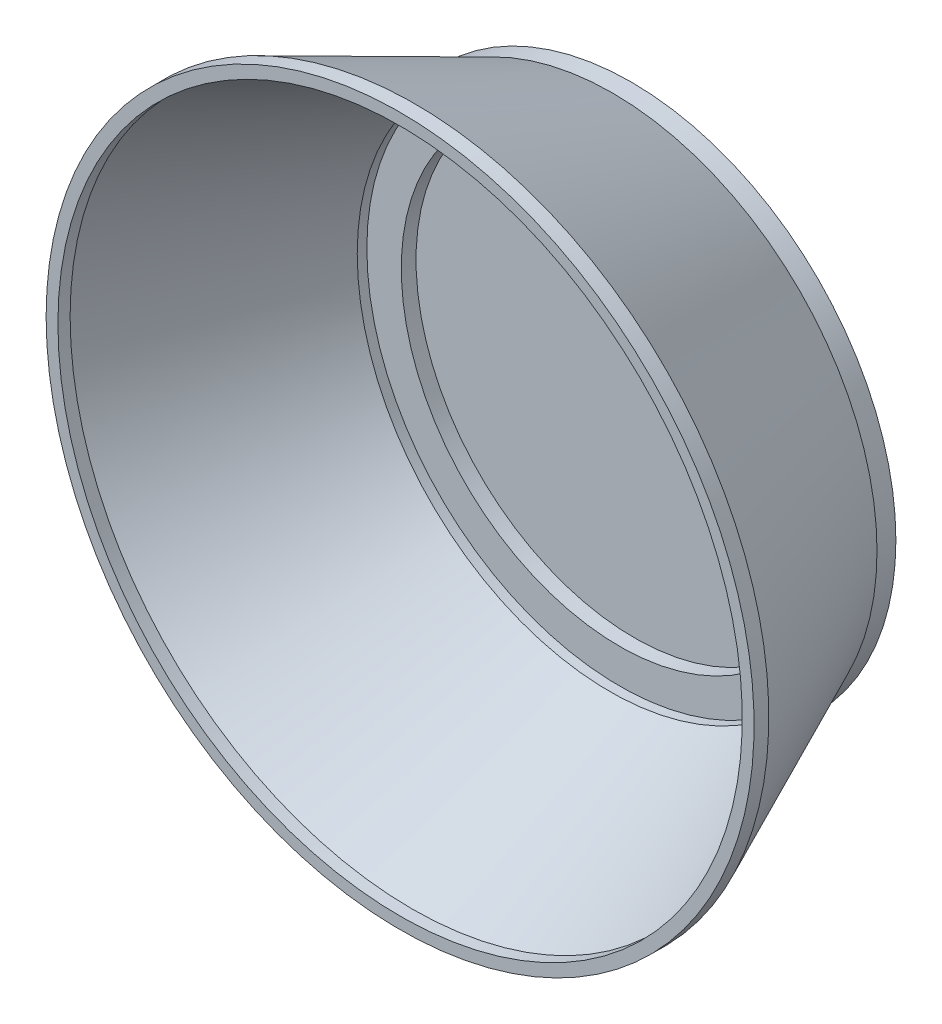
ISO-10303-21;
HEADER;
FILE_DESCRIPTION(('STEP AP214'),'2;1');
FILE_NAME('part.step','',(''),(''),'','','');
FILE_SCHEMA(('AUTOMOTIVE_DESIGN { 1 0 10303 214 1 1 1 1 }'));
ENDSEC;
DATA;
#1=APPLICATION_CONTEXT('core data for automotive mechanical design processes');
#2=APPLICATION_PROTOCOL_DEFINITION('international standard','automotive_design',2000,#1);
#3=PRODUCT_CONTEXT('',#1,'mechanical');
#4=PRODUCT('Part','Part','',(#3));
#5=PRODUCT_RELATED_PRODUCT_CATEGORY('part','',(#4));
#6=PRODUCT_DEFINITION_FORMATION('','',#4);
#7=PRODUCT_DEFINITION_CONTEXT('part definition',#1,'design');
#8=PRODUCT_DEFINITION('design','',#6,#7);
#9=PRODUCT_DEFINITION_SHAPE('','',#8);
#10=(LENGTH_UNIT() NAMED_UNIT(*) SI_UNIT(.MILLI.,.METRE.));
#11=(NAMED_UNIT(*) PLANE_ANGLE_UNIT() SI_UNIT($,.RADIAN.));
#12=(NAMED_UNIT(*) SI_UNIT($,.STERADIAN.) SOLID_ANGLE_UNIT());
#13=UNCERTAINTY_MEASURE_WITH_UNIT(LENGTH_MEASURE(1.E-05),#10,'distance_accuracy_value','');
#14=(GEOMETRIC_REPRESENTATION_CONTEXT(3) GLOBAL_UNCERTAINTY_ASSIGNED_CONTEXT((#13)) GLOBAL_UNIT_ASSIGNED_CONTEXT((#10,
#11,#12)) REPRESENTATION_CONTEXT('',''));
#15=CARTESIAN_POINT('',(0.,0.,0.));
#16=DIRECTION('',(0.,0.,1.));
#17=DIRECTION('',(1.,0.,0.));
#18=AXIS2_PLACEMENT_3D('',#15,#16,#17);
#19=CARTESIAN_POINT('',(0.,0.,0.));
#20=DIRECTION('',(0.,0.,1.));
#21=DIRECTION('',(1.,0.,0.));
#22=AXIS2_PLACEMENT_3D('',#19,#20,#21);
#23=PLANE('',#22);
#24=CARTESIAN_POINT('',(0.,0.,0.));
#25=DIRECTION('',(0.,0.,-1.));
#26=DIRECTION('',(-1.,0.,0.));
#27=AXIS2_PLACEMENT_3D('',#24,#25,#26);
#28=CIRCLE('',#27,24.765);
#29=CARTESIAN_POINT('',(-24.765,0.,0.));
#30=VERTEX_POINT('',#29);
#31=EDGE_CURVE('E10',#30,#30,#28,.T.);
#32=ORIENTED_EDGE('',*,*,#31,.T.);
#33=EDGE_LOOP('',(#32));
#34=FACE_BOUND('',#33,.T.);
#35=ADVANCED_FACE('F43',(#34),#23,.F.);
#36=CARTESIAN_POINT('',(0.,0.,0.));
#37=DIRECTION('',(0.,0.,-1.));
#38=DIRECTION('',(-1.,0.,0.));
#39=AXIS2_PLACEMENT_3D('',#36,#37,#38);
#40=CYLINDRICAL_SURFACE('',#39,24.765);
#41=ORIENTED_EDGE('',*,*,#31,.F.);
#42=EDGE_LOOP('',(#41));
#43=FACE_BOUND('',#42,.T.);
#44=CARTESIAN_POINT('',(0.,0.,1.5875));
#45=DIRECTION('',(0.,0.,-1.));
#46=DIRECTION('',(-1.,0.,0.));
#47=AXIS2_PLACEMENT_3D('',#44,#45,#46);
#48=CIRCLE('',#47,24.765);
#49=CARTESIAN_POINT('',(-24.765,0.,1.5875));
#50=VERTEX_POINT('',#49);
#51=EDGE_CURVE('E50',#50,#50,#48,.T.);
#52=ORIENTED_EDGE('',*,*,#51,.T.);
#53=EDGE_LOOP('',(#52));
#54=FACE_BOUND('',#53,.T.);
#55=ADVANCED_FACE('F116',(#43,#54),#40,.T.);
#56=CARTESIAN_POINT('',(24.765,0.,1.5875));
#57=DIRECTION('',(0.,0.,1.));
#58=DIRECTION('',(1.,0.,0.));
#59=AXIS2_PLACEMENT_3D('',#56,#57,#58);
#60=PLANE('',#59);
#61=ORIENTED_EDGE('',*,*,#51,.F.);
#62=EDGE_LOOP('',(#61));
#63=FACE_BOUND('',#62,.T.);
#64=CARTESIAN_POINT('',(0.,0.,1.5875));
#65=DIRECTION('',(0.,0.,-1.));
#66=DIRECTION('',(-1.,0.,0.));
#67=AXIS2_PLACEMENT_3D('',#64,#65,#66);
#68=CIRCLE('',#67,28.4703296703297);
#69=CARTESIAN_POINT('',(-28.4703296703297,0.,1.5875));
#70=VERTEX_POINT('',#69);
#71=EDGE_CURVE('E55',#70,#70,#68,.T.);
#72=ORIENTED_EDGE('',*,*,#71,.T.);
#73=EDGE_LOOP('',(#72));
#74=FACE_BOUND('',#73,.T.);
#75=ADVANCED_FACE('F120',(#63,#74),#60,.F.);
#76=CARTESIAN_POINT('',(0.,0.,0.));
#77=DIRECTION('',(0.,0.,-1.));
#78=DIRECTION('',(-1.,0.,0.));
#79=AXIS2_PLACEMENT_3D('',#76,#77,#78);
#80=CYLINDRICAL_SURFACE('',#79,28.4703296703297);
#81=ORIENTED_EDGE('',*,*,#71,.F.);
#82=EDGE_LOOP('',(#81));
#83=FACE_BOUND('',#82,.T.);
#84=CARTESIAN_POINT('',(0.,0.,3.6195));
#85=DIRECTION('',(0.,0.,-1.));
#86=DIRECTION('',(-1.,0.,0.));
#87=AXIS2_PLACEMENT_3D('',#84,#85,#86);
#88=CIRCLE('',#87,28.4703296703297);
#89=CARTESIAN_POINT('',(-28.4703296703297,0.,3.6195));
#90=VERTEX_POINT('',#89);
#91=EDGE_CURVE('E60',#90,#90,#88,.T.);
#92=ORIENTED_EDGE('',*,*,#91,.T.);
#93=EDGE_LOOP('',(#92));
#94=FACE_BOUND('',#93,.T.);
#95=ADVANCED_FACE('F125',(#83,#94),#80,.T.);
#96=CARTESIAN_POINT('',(0.,0.,24.892));
#97=DIRECTION('',(0.,0.,1.));
#98=DIRECTION('',(1.,0.,0.));
#99=AXIS2_PLACEMENT_3D('',#96,#97,#98);
#100=CONICAL_SURFACE('',#99,38.1,0.425081746401457);
#101=ORIENTED_EDGE('',*,*,#91,.F.);
#102=EDGE_LOOP('',(#101));
#103=FACE_BOUND('',#102,.T.);
#104=CARTESIAN_POINT('',(0.,0.,24.892));
#105=DIRECTION('',(0.,0.,-1.));
#106=DIRECTION('',(-1.,0.,0.));
#107=AXIS2_PLACEMENT_3D('',#104,#105,#106);
#108=CIRCLE('',#107,38.1);
#109=CARTESIAN_POINT('',(-38.1,0.,24.892));
#110=VERTEX_POINT('',#109);
#111=EDGE_CURVE('E66',#110,#110,#108,.T.);
#112=ORIENTED_EDGE('',*,*,#111,.T.);
#113=EDGE_LOOP('',(#112));
#114=FACE_BOUND('',#113,.T.);
#115=ADVANCED_FACE('F131',(#103,#114),#100,.T.);
#116=CARTESIAN_POINT('',(0.,0.,0.));
#117=DIRECTION('',(0.,0.,-1.));
#118=DIRECTION('',(-1.,0.,0.));
#119=AXIS2_PLACEMENT_3D('',#116,#117,#118);
#120=CYLINDRICAL_SURFACE('',#119,38.1);
#121=ORIENTED_EDGE('',*,*,#111,.F.);
#122=EDGE_LOOP('',(#121));
#123=FACE_BOUND('',#122,.T.);
#124=CARTESIAN_POINT('',(0.,0.,26.4795));
#125=DIRECTION('',(0.,0.,-1.));
#126=DIRECTION('',(-1.,0.,0.));
#127=AXIS2_PLACEMENT_3D('',#124,#125,#126);
#128=CIRCLE('',#127,38.1);
#129=CARTESIAN_POINT('',(-38.1,0.,26.4795));
#130=VERTEX_POINT('',#129);
#131=EDGE_CURVE('E70',#130,#130,#128,.T.);
#132=ORIENTED_EDGE('',*,*,#131,.T.);
#133=EDGE_LOOP('',(#132));
#134=FACE_BOUND('',#133,.T.);
#135=ADVANCED_FACE('F112',(#123,#134),#120,.T.);
#136=CARTESIAN_POINT('',(38.1,0.,26.4795));
#137=DIRECTION('',(0.,0.,-1.));
#138=DIRECTION('',(-1.,0.,0.));
#139=AXIS2_PLACEMENT_3D('',#136,#137,#138);
#140=PLANE('',#139);
#141=CARTESIAN_POINT('',(0.,0.,26.4795));
#142=DIRECTION('',(0.,0.,-1.));
#143=DIRECTION('',(-1.,0.,0.));
#144=AXIS2_PLACEMENT_3D('',#141,#142,#143);
#145=CIRCLE('',#144,36.83);
#146=CARTESIAN_POINT('',(-36.83,0.,26.4795));
#147=VERTEX_POINT('',#146);
#148=EDGE_CURVE('E75',#147,#147,#145,.T.);
#149=ORIENTED_EDGE('',*,*,#148,.T.);
#150=EDGE_LOOP('',(#149));
#151=FACE_BOUND('',#150,.T.);
#152=ORIENTED_EDGE('',*,*,#131,.F.);
#153=EDGE_LOOP('',(#152));
#154=FACE_BOUND('',#153,.T.);
#155=ADVANCED_FACE('F104',(#151,#154),#140,.F.);
#156=CARTESIAN_POINT('',(0.,0.,1.27));
#157=DIRECTION('',(0.,0.,1.));
#158=DIRECTION('',(1.,0.,0.));
#159=AXIS2_PLACEMENT_3D('',#156,#157,#158);
#160=PLANE('',#159);
#161=CARTESIAN_POINT('',(0.,0.,1.27));
#162=DIRECTION('',(0.,0.,1.));
#163=DIRECTION('',(1.,0.,0.));
#164=AXIS2_PLACEMENT_3D('',#161,#162,#163);
#165=CIRCLE('',#164,23.495);
#166=CARTESIAN_POINT('',(23.495,0.,1.27));
#167=VERTEX_POINT('',#166);
#168=EDGE_CURVE('E74',#167,#167,#165,.F.);
#169=ORIENTED_EDGE('',*,*,#168,.F.);
#170=EDGE_LOOP('',(#169));
#171=FACE_BOUND('',#170,.T.);
#172=ADVANCED_FACE('F102',(#171),#160,.T.);
#173=CARTESIAN_POINT('',(0.,0.,0.));
#174=DIRECTION('',(0.,0.,-1.));
#175=DIRECTION('',(-1.,0.,0.));
#176=AXIS2_PLACEMENT_3D('',#173,#174,#175);
#177=CYLINDRICAL_SURFACE('',#176,23.495);
#178=ORIENTED_EDGE('',*,*,#168,.T.);
#179=EDGE_LOOP('',(#178));
#180=FACE_BOUND('',#179,.T.);
#181=CARTESIAN_POINT('',(0.,0.,2.8575));
#182=DIRECTION('',(0.,0.,1.));
#183=DIRECTION('',(1.,0.,0.));
#184=AXIS2_PLACEMENT_3D('',#181,#182,#183);
#185=CIRCLE('',#184,23.495);
#186=CARTESIAN_POINT('',(23.495,0.,2.8575));
#187=VERTEX_POINT('',#186);
#188=EDGE_CURVE('E91',#187,#187,#185,.F.);
#189=ORIENTED_EDGE('',*,*,#188,.F.);
#190=EDGE_LOOP('',(#189));
#191=FACE_BOUND('',#190,.T.);
#192=ADVANCED_FACE('F99',(#180,#191),#177,.F.);
#193=CARTESIAN_POINT('',(24.765,0.,2.8575));
#194=DIRECTION('',(0.,0.,1.));
#195=DIRECTION('',(1.,0.,0.));
#196=AXIS2_PLACEMENT_3D('',#193,#194,#195);
#197=PLANE('',#196);
#198=ORIENTED_EDGE('',*,*,#188,.T.);
#199=EDGE_LOOP('',(#198));
#200=FACE_BOUND('',#199,.T.);
#201=CARTESIAN_POINT('',(0.,0.,2.8575));
#202=DIRECTION('',(0.,0.,1.));
#203=DIRECTION('',(1.,0.,0.));
#204=AXIS2_PLACEMENT_3D('',#201,#202,#203);
#205=CIRCLE('',#204,27.2003296703297);
#206=CARTESIAN_POINT('',(27.2003296703297,0.,2.8575));
#207=VERTEX_POINT('',#206);
#208=EDGE_CURVE('E87',#207,#207,#205,.F.);
#209=ORIENTED_EDGE('',*,*,#208,.F.);
#210=EDGE_LOOP('',(#209));
#211=FACE_BOUND('',#210,.T.);
#212=ADVANCED_FACE('F110',(#200,#211),#197,.T.);
#213=CARTESIAN_POINT('',(0.,0.,0.));
#214=DIRECTION('',(0.,0.,-1.));
#215=DIRECTION('',(-1.,0.,0.));
#216=AXIS2_PLACEMENT_3D('',#213,#214,#215);
#217=CYLINDRICAL_SURFACE('',#216,27.2003296703297);
#218=ORIENTED_EDGE('',*,*,#208,.T.);
#219=EDGE_LOOP('',(#218));
#220=FACE_BOUND('',#219,.T.);
#221=CARTESIAN_POINT('',(0.,0.,3.89356624608282));
#222=DIRECTION('',(0.,0.,1.));
#223=DIRECTION('',(1.,0.,0.));
#224=AXIS2_PLACEMENT_3D('',#221,#222,#223);
#225=CIRCLE('',#224,27.2003296703297);
#226=CARTESIAN_POINT('',(27.2003296703297,0.,3.89356624608282));
#227=VERTEX_POINT('',#226);
#228=EDGE_CURVE('E83',#227,#227,#225,.F.);
#229=ORIENTED_EDGE('',*,*,#228,.F.);
#230=EDGE_LOOP('',(#229));
#231=FACE_BOUND('',#230,.T.);
#232=ADVANCED_FACE('F146',(#220,#231),#217,.F.);
#233=CARTESIAN_POINT('',(0.,0.,25.4157419732197));
#234=DIRECTION('',(0.,0.,1.));
#235=DIRECTION('',(1.,0.,0.));
#236=AXIS2_PLACEMENT_3D('',#233,#234,#235);
#237=CONICAL_SURFACE('',#236,36.9430236193042,0.425081746401457);
#238=ORIENTED_EDGE('',*,*,#228,.T.);
#239=EDGE_LOOP('',(#238));
#240=FACE_BOUND('',#239,.T.);
#241=CARTESIAN_POINT('',(0.,0.,25.1660662460828));
#242=DIRECTION('',(0.,0.,1.));
#243=DIRECTION('',(1.,0.,0.));
#244=AXIS2_PLACEMENT_3D('',#241,#242,#243);
#245=CIRCLE('',#244,36.83);
#246=CARTESIAN_POINT('',(36.83,0.,25.1660662460828));
#247=VERTEX_POINT('',#246);
#248=EDGE_CURVE('E79',#247,#247,#245,.F.);
#249=ORIENTED_EDGE('',*,*,#248,.F.);
#250=EDGE_LOOP('',(#249));
#251=FACE_BOUND('',#250,.T.);
#252=ADVANCED_FACE('F142',(#240,#251),#237,.F.);
#253=CARTESIAN_POINT('',(0.,0.,0.));
#254=DIRECTION('',(0.,0.,-1.));
#255=DIRECTION('',(-1.,0.,0.));
#256=AXIS2_PLACEMENT_3D('',#253,#254,#255);
#257=CYLINDRICAL_SURFACE('',#256,36.83);
#258=ORIENTED_EDGE('',*,*,#248,.T.);
#259=EDGE_LOOP('',(#258));
#260=FACE_BOUND('',#259,.T.);
#261=ORIENTED_EDGE('',*,*,#148,.F.);
#262=EDGE_LOOP('',(#261));
#263=FACE_BOUND('',#262,.T.);
#264=ADVANCED_FACE('F139',(#260,#263),#257,.F.);
#265=CLOSED_SHELL('',(#35,#55,#75,#95,#115,#135,#155,#172,#192,#212,#232,#252,#264));
#266=MANIFOLD_SOLID_BREP('B2',#265);
#267=ADVANCED_BREP_SHAPE_REPRESENTATION('',(#18,#266),#14);
#268=SHAPE_DEFINITION_REPRESENTATION(#9,#267);
ENDSEC;
END-ISO-10303-21;
